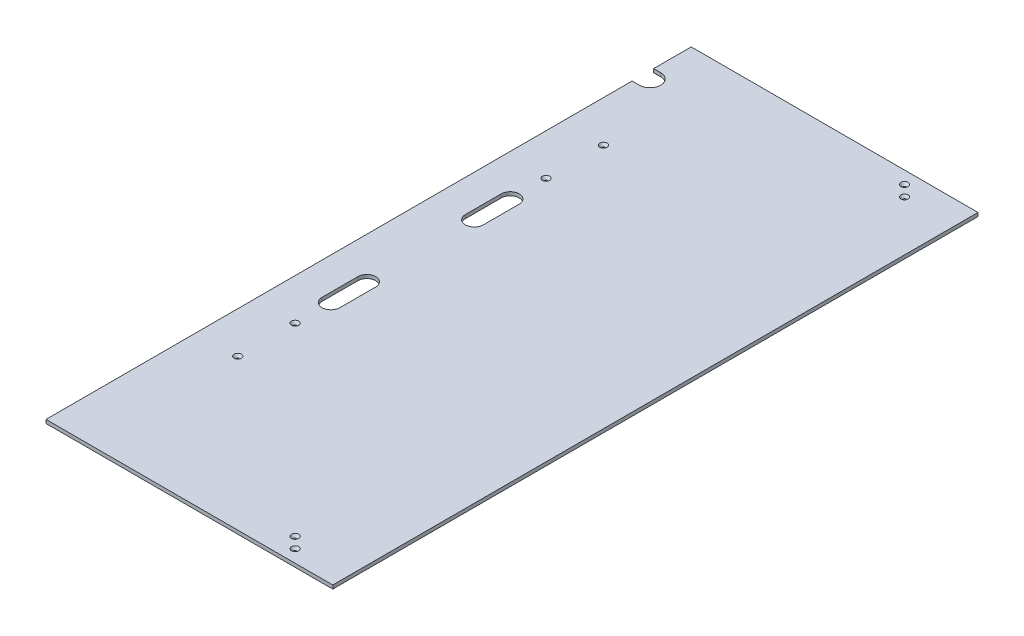
ISO-10303-21;
HEADER;
FILE_DESCRIPTION(('STEP AP214'),'2;1');
FILE_NAME('part.step','',(''),(''),'','','');
FILE_SCHEMA(('AUTOMOTIVE_DESIGN { 1 0 10303 214 1 1 1 1 }'));
ENDSEC;
DATA;
#1=APPLICATION_CONTEXT('core data for automotive mechanical design processes');
#2=APPLICATION_PROTOCOL_DEFINITION('international standard','automotive_design',2000,#1);
#3=PRODUCT_CONTEXT('',#1,'mechanical');
#4=PRODUCT('Part','Part','',(#3));
#5=PRODUCT_RELATED_PRODUCT_CATEGORY('part','',(#4));
#6=PRODUCT_DEFINITION_FORMATION('','',#4);
#7=PRODUCT_DEFINITION_CONTEXT('part definition',#1,'design');
#8=PRODUCT_DEFINITION('design','',#6,#7);
#9=PRODUCT_DEFINITION_SHAPE('','',#8);
#10=(LENGTH_UNIT() NAMED_UNIT(*) SI_UNIT(.MILLI.,.METRE.));
#11=(NAMED_UNIT(*) PLANE_ANGLE_UNIT() SI_UNIT($,.RADIAN.));
#12=(NAMED_UNIT(*) SI_UNIT($,.STERADIAN.) SOLID_ANGLE_UNIT());
#13=UNCERTAINTY_MEASURE_WITH_UNIT(LENGTH_MEASURE(1.E-05),#10,'distance_accuracy_value','');
#14=(GEOMETRIC_REPRESENTATION_CONTEXT(3) GLOBAL_UNCERTAINTY_ASSIGNED_CONTEXT((#13)) GLOBAL_UNIT_ASSIGNED_CONTEXT((#10,
#11,#12)) REPRESENTATION_CONTEXT('',''));
#15=CARTESIAN_POINT('',(0.,0.,0.));
#16=DIRECTION('',(0.,0.,1.));
#17=DIRECTION('',(1.,0.,0.));
#18=AXIS2_PLACEMENT_3D('',#15,#16,#17);
#19=CARTESIAN_POINT('',(-180.975,6.34999999994079,203.2));
#20=DIRECTION('',(0.,1.,0.));
#21=DIRECTION('',(0.,0.,1.));
#22=AXIS2_PLACEMENT_3D('',#19,#20,#21);
#23=CONICAL_SURFACE('',#22,6.43889999993152,0.715584993313781);
#24=CARTESIAN_POINT('',(-180.975,1.87943829585783,203.2));
#25=DIRECTION('',(0.,1.,0.));
#26=DIRECTION('',(0.,0.,1.));
#27=AXIS2_PLACEMENT_3D('',#24,#25,#26);
#28=CIRCLE('',#27,2.5527);
#29=CARTESIAN_POINT('',(-180.975,1.87943829585783,205.7527));
#30=VERTEX_POINT('',#29);
#31=EDGE_CURVE('E203',#30,#30,#28,.F.);
#32=ORIENTED_EDGE('',*,*,#31,.T.);
#33=EDGE_LOOP('',(#32));
#34=FACE_BOUND('',#33,.T.);
#35=CARTESIAN_POINT('',(-180.975,6.34999999999764,203.2));
#36=DIRECTION('',(0.,1.,0.));
#37=DIRECTION('',(0.,0.,1.));
#38=AXIS2_PLACEMENT_3D('',#35,#36,#37);
#39=CIRCLE('',#38,6.43889999998094);
#40=CARTESIAN_POINT('',(-180.975,6.34999999999764,209.638899999981));
#41=VERTEX_POINT('',#40);
#42=EDGE_CURVE('E19',#41,#41,#39,.F.);
#43=ORIENTED_EDGE('',*,*,#42,.F.);
#44=EDGE_LOOP('',(#43));
#45=FACE_BOUND('',#44,.T.);
#46=ADVANCED_FACE('F16',(#34,#45),#23,.F.);
#47=CARTESIAN_POINT('',(-180.975,6.34999999994079,-241.3));
#48=DIRECTION('',(0.,1.,0.));
#49=DIRECTION('',(0.,0.,1.));
#50=AXIS2_PLACEMENT_3D('',#47,#48,#49);
#51=CONICAL_SURFACE('',#50,6.43889999993152,0.715584993313781);
#52=CARTESIAN_POINT('',(-180.975,1.87943829585783,-241.3));
#53=DIRECTION('',(0.,1.,0.));
#54=DIRECTION('',(0.,0.,1.));
#55=AXIS2_PLACEMENT_3D('',#52,#53,#54);
#56=CIRCLE('',#55,2.5527);
#57=CARTESIAN_POINT('',(-180.975,1.87943829585783,-238.7473));
#58=VERTEX_POINT('',#57);
#59=EDGE_CURVE('E200',#58,#58,#56,.F.);
#60=ORIENTED_EDGE('',*,*,#59,.T.);
#61=EDGE_LOOP('',(#60));
#62=FACE_BOUND('',#61,.T.);
#63=CARTESIAN_POINT('',(-180.975,6.34999999999764,-241.3));
#64=DIRECTION('',(0.,1.,0.));
#65=DIRECTION('',(0.,0.,1.));
#66=AXIS2_PLACEMENT_3D('',#63,#64,#65);
#67=CIRCLE('',#66,6.43889999998094);
#68=CARTESIAN_POINT('',(-180.975,6.34999999999764,-234.861100000019));
#69=VERTEX_POINT('',#68);
#70=EDGE_CURVE('E296',#69,#69,#67,.F.);
#71=ORIENTED_EDGE('',*,*,#70,.F.);
#72=EDGE_LOOP('',(#71));
#73=FACE_BOUND('',#72,.T.);
#74=ADVANCED_FACE('F305',(#62,#73),#51,.F.);
#75=CARTESIAN_POINT('',(-180.975,6.34999999994079,-342.9));
#76=DIRECTION('',(0.,1.,0.));
#77=DIRECTION('',(0.,0.,1.));
#78=AXIS2_PLACEMENT_3D('',#75,#76,#77);
#79=CONICAL_SURFACE('',#78,6.43889999993152,0.715584993313781);
#80=CARTESIAN_POINT('',(-180.975,1.87943829585783,-342.9));
#81=DIRECTION('',(0.,1.,0.));
#82=DIRECTION('',(0.,0.,1.));
#83=AXIS2_PLACEMENT_3D('',#80,#81,#82);
#84=CIRCLE('',#83,2.5527);
#85=CARTESIAN_POINT('',(-180.975,1.87943829585783,-340.3473));
#86=VERTEX_POINT('',#85);
#87=EDGE_CURVE('E197',#86,#86,#84,.F.);
#88=ORIENTED_EDGE('',*,*,#87,.T.);
#89=EDGE_LOOP('',(#88));
#90=FACE_BOUND('',#89,.T.);
#91=CARTESIAN_POINT('',(-180.975,6.34999999999764,-342.9));
#92=DIRECTION('',(0.,1.,0.));
#93=DIRECTION('',(0.,0.,1.));
#94=AXIS2_PLACEMENT_3D('',#91,#92,#93);
#95=CIRCLE('',#94,6.43889999998094);
#96=CARTESIAN_POINT('',(-180.975,6.34999999999764,-336.461100000019));
#97=VERTEX_POINT('',#96);
#98=EDGE_CURVE('E294',#97,#97,#95,.F.);
#99=ORIENTED_EDGE('',*,*,#98,.F.);
#100=EDGE_LOOP('',(#99));
#101=FACE_BOUND('',#100,.T.);
#102=ADVANCED_FACE('F311',(#90,#101),#79,.F.);
#103=CARTESIAN_POINT('',(165.1,6.34999999994079,549.275));
#104=DIRECTION('',(0.,1.,0.));
#105=DIRECTION('',(0.,0.,1.));
#106=AXIS2_PLACEMENT_3D('',#103,#104,#105);
#107=CONICAL_SURFACE('',#106,6.43889999997319,0.715584993313781);
#108=CARTESIAN_POINT('',(165.1,1.87943829585783,549.275));
#109=DIRECTION('',(0.,1.,0.));
#110=DIRECTION('',(0.,0.,1.));
#111=AXIS2_PLACEMENT_3D('',#108,#109,#110);
#112=CIRCLE('',#111,2.5527);
#113=CARTESIAN_POINT('',(165.1,1.87943829585783,551.8277));
#114=VERTEX_POINT('',#113);
#115=EDGE_CURVE('E194',#114,#114,#112,.F.);
#116=ORIENTED_EDGE('',*,*,#115,.T.);
#117=EDGE_LOOP('',(#116));
#118=FACE_BOUND('',#117,.T.);
#119=CARTESIAN_POINT('',(165.1,6.34999999999764,549.275));
#120=DIRECTION('',(0.,1.,0.));
#121=DIRECTION('',(0.,0.,1.));
#122=AXIS2_PLACEMENT_3D('',#119,#120,#121);
#123=CIRCLE('',#122,6.4389000000226);
#124=CARTESIAN_POINT('',(165.1,6.34999999999764,555.713900000022));
#125=VERTEX_POINT('',#124);
#126=EDGE_CURVE('E291',#125,#125,#123,.F.);
#127=ORIENTED_EDGE('',*,*,#126,.F.);
#128=EDGE_LOOP('',(#127));
#129=FACE_BOUND('',#128,.T.);
#130=ADVANCED_FACE('F430',(#118,#129),#107,.F.);
#131=CARTESIAN_POINT('',(146.05,6.34999999994079,530.225));
#132=DIRECTION('',(0.,1.,0.));
#133=DIRECTION('',(0.,0.,1.));
#134=AXIS2_PLACEMENT_3D('',#131,#132,#133);
#135=CONICAL_SURFACE('',#134,6.43889999992345,0.715584993313781);
#136=CARTESIAN_POINT('',(146.05,1.87943829585783,530.225));
#137=DIRECTION('',(0.,1.,0.));
#138=DIRECTION('',(0.,0.,1.));
#139=AXIS2_PLACEMENT_3D('',#136,#137,#138);
#140=CIRCLE('',#139,2.5527);
#141=CARTESIAN_POINT('',(146.05,1.87943829585783,532.7777));
#142=VERTEX_POINT('',#141);
#143=EDGE_CURVE('E191',#142,#142,#140,.F.);
#144=ORIENTED_EDGE('',*,*,#143,.T.);
#145=EDGE_LOOP('',(#144));
#146=FACE_BOUND('',#145,.T.);
#147=CARTESIAN_POINT('',(146.05,6.34999999999764,530.225));
#148=DIRECTION('',(0.,1.,0.));
#149=DIRECTION('',(0.,0.,1.));
#150=AXIS2_PLACEMENT_3D('',#147,#148,#149);
#151=CIRCLE('',#150,6.43889999997286);
#152=CARTESIAN_POINT('',(146.05,6.34999999999764,536.663899999973));
#153=VERTEX_POINT('',#152);
#154=EDGE_CURVE('E288',#153,#153,#151,.F.);
#155=ORIENTED_EDGE('',*,*,#154,.F.);
#156=EDGE_LOOP('',(#155));
#157=FACE_BOUND('',#156,.T.);
#158=ADVANCED_FACE('F426',(#146,#157),#135,.F.);
#159=CARTESIAN_POINT('',(-180.975,6.34999999994079,304.8));
#160=DIRECTION('',(0.,1.,0.));
#161=DIRECTION('',(0.,0.,1.));
#162=AXIS2_PLACEMENT_3D('',#159,#160,#161);
#163=CONICAL_SURFACE('',#162,6.43889999993152,0.715584993313781);
#164=CARTESIAN_POINT('',(-180.975,1.87943829585783,304.8));
#165=DIRECTION('',(0.,1.,0.));
#166=DIRECTION('',(0.,0.,1.));
#167=AXIS2_PLACEMENT_3D('',#164,#165,#166);
#168=CIRCLE('',#167,2.5527);
#169=CARTESIAN_POINT('',(-180.975,1.87943829585783,307.3527));
#170=VERTEX_POINT('',#169);
#171=EDGE_CURVE('E188',#170,#170,#168,.F.);
#172=ORIENTED_EDGE('',*,*,#171,.T.);
#173=EDGE_LOOP('',(#172));
#174=FACE_BOUND('',#173,.T.);
#175=CARTESIAN_POINT('',(-180.975,6.34999999999764,304.8));
#176=DIRECTION('',(0.,1.,0.));
#177=DIRECTION('',(0.,0.,1.));
#178=AXIS2_PLACEMENT_3D('',#175,#176,#177);
#179=CIRCLE('',#178,6.43889999998094);
#180=CARTESIAN_POINT('',(-180.975,6.34999999999764,311.238899999981));
#181=VERTEX_POINT('',#180);
#182=EDGE_CURVE('E285',#181,#181,#179,.F.);
#183=ORIENTED_EDGE('',*,*,#182,.F.);
#184=EDGE_LOOP('',(#183));
#185=FACE_BOUND('',#184,.T.);
#186=ADVANCED_FACE('F422',(#174,#185),#163,.F.);
#187=CARTESIAN_POINT('',(146.05,6.34999999994079,-549.275));
#188=DIRECTION('',(0.,1.,0.));
#189=DIRECTION('',(0.,0.,1.));
#190=AXIS2_PLACEMENT_3D('',#187,#188,#189);
#191=CONICAL_SURFACE('',#190,6.43889999992345,0.715584993313781);
#192=CARTESIAN_POINT('',(146.05,1.87943829585783,-549.275));
#193=DIRECTION('',(0.,1.,0.));
#194=DIRECTION('',(0.,0.,1.));
#195=AXIS2_PLACEMENT_3D('',#192,#193,#194);
#196=CIRCLE('',#195,2.5527);
#197=CARTESIAN_POINT('',(146.05,1.87943829585783,-546.7223));
#198=VERTEX_POINT('',#197);
#199=EDGE_CURVE('E185',#198,#198,#196,.F.);
#200=ORIENTED_EDGE('',*,*,#199,.T.);
#201=EDGE_LOOP('',(#200));
#202=FACE_BOUND('',#201,.T.);
#203=CARTESIAN_POINT('',(146.05,6.34999999999764,-549.275));
#204=DIRECTION('',(0.,1.,0.));
#205=DIRECTION('',(0.,0.,1.));
#206=AXIS2_PLACEMENT_3D('',#203,#204,#205);
#207=CIRCLE('',#206,6.43889999997286);
#208=CARTESIAN_POINT('',(146.05,6.34999999999764,-542.836100000027));
#209=VERTEX_POINT('',#208);
#210=EDGE_CURVE('E282',#209,#209,#207,.F.);
#211=ORIENTED_EDGE('',*,*,#210,.F.);
#212=EDGE_LOOP('',(#211));
#213=FACE_BOUND('',#212,.T.);
#214=ADVANCED_FACE('F418',(#202,#213),#191,.F.);
#215=CARTESIAN_POINT('',(165.1,6.34999999994079,-530.225));
#216=DIRECTION('',(0.,1.,0.));
#217=DIRECTION('',(0.,0.,1.));
#218=AXIS2_PLACEMENT_3D('',#215,#216,#217);
#219=CONICAL_SURFACE('',#218,6.43889999997319,0.715584993313781);
#220=CARTESIAN_POINT('',(165.1,1.87943829585783,-530.225));
#221=DIRECTION('',(0.,1.,0.));
#222=DIRECTION('',(0.,0.,1.));
#223=AXIS2_PLACEMENT_3D('',#220,#221,#222);
#224=CIRCLE('',#223,2.5527);
#225=CARTESIAN_POINT('',(165.1,1.87943829585783,-527.6723));
#226=VERTEX_POINT('',#225);
#227=EDGE_CURVE('E182',#226,#226,#224,.F.);
#228=ORIENTED_EDGE('',*,*,#227,.T.);
#229=EDGE_LOOP('',(#228));
#230=FACE_BOUND('',#229,.T.);
#231=CARTESIAN_POINT('',(165.1,6.34999999999764,-530.225));
#232=DIRECTION('',(0.,1.,0.));
#233=DIRECTION('',(0.,0.,1.));
#234=AXIS2_PLACEMENT_3D('',#231,#232,#233);
#235=CIRCLE('',#234,6.4389000000226);
#236=CARTESIAN_POINT('',(165.1,6.34999999999764,-523.786099999977));
#237=VERTEX_POINT('',#236);
#238=EDGE_CURVE('E152',#237,#237,#235,.F.);
#239=ORIENTED_EDGE('',*,*,#238,.F.);
#240=EDGE_LOOP('',(#239));
#241=FACE_BOUND('',#240,.T.);
#242=ADVANCED_FACE('F414',(#230,#241),#219,.F.);
#243=CARTESIAN_POINT('',(254.,6.35,-571.5));
#244=DIRECTION('',(0.,1.,0.));
#245=DIRECTION('',(0.,0.,1.));
#246=AXIS2_PLACEMENT_3D('',#243,#244,#245);
#247=PLANE('',#246);
#248=DIRECTION('',(0.,0.,-1.));
#249=VECTOR('',#248,1.);
#250=CARTESIAN_POINT('',(-165.1,6.35,-114.3));
#251=LINE('',#250,#249);
#252=CARTESIAN_POINT('',(-165.1,6.35,-177.8));
#253=VERTEX_POINT('',#252);
#254=CARTESIAN_POINT('',(-165.1,6.35,-114.3));
#255=VERTEX_POINT('',#254);
#256=EDGE_CURVE('E171',#253,#255,#251,.F.);
#257=ORIENTED_EDGE('',*,*,#256,.T.);
#258=CARTESIAN_POINT('',(-180.975,6.35,-114.3));
#259=DIRECTION('',(0.,1.,0.));
#260=DIRECTION('',(0.,0.,1.));
#261=AXIS2_PLACEMENT_3D('',#258,#259,#260);
#262=CIRCLE('',#261,15.875);
#263=CARTESIAN_POINT('',(-196.85,6.35,-114.3));
#264=VERTEX_POINT('',#263);
#265=EDGE_CURVE('E271',#255,#264,#262,.F.);
#266=ORIENTED_EDGE('',*,*,#265,.T.);
#267=DIRECTION('',(0.,0.,1.));
#268=VECTOR('',#267,1.);
#269=CARTESIAN_POINT('',(-196.85,6.35,-177.8));
#270=LINE('',#269,#268);
#271=CARTESIAN_POINT('',(-196.85,6.35,-177.8));
#272=VERTEX_POINT('',#271);
#273=EDGE_CURVE('E167',#264,#272,#270,.F.);
#274=ORIENTED_EDGE('',*,*,#273,.T.);
#275=CARTESIAN_POINT('',(-180.975,6.35,-177.8));
#276=DIRECTION('',(0.,1.,0.));
#277=DIRECTION('',(0.,0.,1.));
#278=AXIS2_PLACEMENT_3D('',#275,#276,#277);
#279=CIRCLE('',#278,15.875);
#280=EDGE_CURVE('E173',#272,#253,#279,.F.);
#281=ORIENTED_EDGE('',*,*,#280,.T.);
#282=EDGE_LOOP('',(#257,#266,#274,#281));
#283=FACE_BOUND('',#282,.T.);
#284=DIRECTION('',(0.,0.,-1.));
#285=VECTOR('',#284,1.);
#286=CARTESIAN_POINT('',(-165.1,6.35,139.7));
#287=LINE('',#286,#285);
#288=CARTESIAN_POINT('',(-165.1,6.35,76.2));
#289=VERTEX_POINT('',#288);
#290=CARTESIAN_POINT('',(-165.1,6.35,139.7));
#291=VERTEX_POINT('',#290);
#292=EDGE_CURVE('E179',#289,#291,#287,.F.);
#293=ORIENTED_EDGE('',*,*,#292,.T.);
#294=CARTESIAN_POINT('',(-180.975,6.35,139.7));
#295=DIRECTION('',(0.,1.,0.));
#296=DIRECTION('',(0.,0.,1.));
#297=AXIS2_PLACEMENT_3D('',#294,#295,#296);
#298=CIRCLE('',#297,15.875);
#299=CARTESIAN_POINT('',(-196.85,6.35,139.7));
#300=VERTEX_POINT('',#299);
#301=EDGE_CURVE('E275',#291,#300,#298,.F.);
#302=ORIENTED_EDGE('',*,*,#301,.T.);
#303=DIRECTION('',(0.,0.,1.));
#304=VECTOR('',#303,1.);
#305=CARTESIAN_POINT('',(-196.85,6.35,76.2));
#306=LINE('',#305,#304);
#307=CARTESIAN_POINT('',(-196.85,6.35,76.2));
#308=VERTEX_POINT('',#307);
#309=EDGE_CURVE('E175',#300,#308,#306,.F.);
#310=ORIENTED_EDGE('',*,*,#309,.T.);
#311=CARTESIAN_POINT('',(-180.975,6.35,76.2));
#312=DIRECTION('',(0.,1.,0.));
#313=DIRECTION('',(0.,0.,1.));
#314=AXIS2_PLACEMENT_3D('',#311,#312,#313);
#315=CIRCLE('',#314,15.875);
#316=EDGE_CURVE('E181',#308,#289,#315,.F.);
#317=ORIENTED_EDGE('',*,*,#316,.T.);
#318=EDGE_LOOP('',(#293,#302,#310,#317));
#319=FACE_BOUND('',#318,.T.);
#320=ORIENTED_EDGE('',*,*,#238,.T.);
#321=EDGE_LOOP('',(#320));
#322=FACE_BOUND('',#321,.T.);
#323=ORIENTED_EDGE('',*,*,#210,.T.);
#324=EDGE_LOOP('',(#323));
#325=FACE_BOUND('',#324,.T.);
#326=ORIENTED_EDGE('',*,*,#182,.T.);
#327=EDGE_LOOP('',(#326));
#328=FACE_BOUND('',#327,.T.);
#329=ORIENTED_EDGE('',*,*,#154,.T.);
#330=EDGE_LOOP('',(#329));
#331=FACE_BOUND('',#330,.T.);
#332=ORIENTED_EDGE('',*,*,#126,.T.);
#333=EDGE_LOOP('',(#332));
#334=FACE_BOUND('',#333,.T.);
#335=ORIENTED_EDGE('',*,*,#98,.T.);
#336=EDGE_LOOP('',(#335));
#337=FACE_BOUND('',#336,.T.);
#338=ORIENTED_EDGE('',*,*,#70,.T.);
#339=EDGE_LOOP('',(#338));
#340=FACE_BOUND('',#339,.T.);
#341=ORIENTED_EDGE('',*,*,#42,.T.);
#342=EDGE_LOOP('',(#341));
#343=FACE_BOUND('',#342,.T.);
#344=DIRECTION('',(-1.,0.,0.));
#345=VECTOR('',#344,1.);
#346=CARTESIAN_POINT('',(-241.3,6.35,-504.825));
#347=LINE('',#346,#345);
#348=CARTESIAN_POINT('',(-254.,6.35,-504.825));
#349=VERTEX_POINT('',#348);
#350=CARTESIAN_POINT('',(-241.3,6.35,-504.825));
#351=VERTEX_POINT('',#350);
#352=EDGE_CURVE('E140',#349,#351,#347,.F.);
#353=ORIENTED_EDGE('',*,*,#352,.T.);
#354=CARTESIAN_POINT('',(-241.3,6.35,-485.775));
#355=DIRECTION('',(0.,1.,0.));
#356=DIRECTION('',(0.,0.,1.));
#357=AXIS2_PLACEMENT_3D('',#354,#355,#356);
#358=CIRCLE('',#357,19.05);
#359=CARTESIAN_POINT('',(-241.3,6.35,-466.725));
#360=VERTEX_POINT('',#359);
#361=EDGE_CURVE('E97',#351,#360,#358,.F.);
#362=ORIENTED_EDGE('',*,*,#361,.T.);
#363=DIRECTION('',(1.,0.,0.));
#364=VECTOR('',#363,1.);
#365=CARTESIAN_POINT('',(-254.,6.35,-466.725));
#366=LINE('',#365,#364);
#367=CARTESIAN_POINT('',(-254.,6.35,-466.725));
#368=VERTEX_POINT('',#367);
#369=EDGE_CURVE('E106',#360,#368,#366,.F.);
#370=ORIENTED_EDGE('',*,*,#369,.T.);
#371=DIRECTION('',(0.,0.,1.));
#372=VECTOR('',#371,1.);
#373=CARTESIAN_POINT('',(-254.,6.35,-571.5));
#374=LINE('',#373,#372);
#375=CARTESIAN_POINT('',(-254.,6.35,571.5));
#376=VERTEX_POINT('',#375);
#377=EDGE_CURVE('E209',#376,#368,#374,.F.);
#378=ORIENTED_EDGE('',*,*,#377,.F.);
#379=DIRECTION('',(1.,0.,0.));
#380=VECTOR('',#379,1.);
#381=CARTESIAN_POINT('',(0.,6.35,571.5));
#382=LINE('',#381,#380);
#383=CARTESIAN_POINT('',(254.,6.35,571.5));
#384=VERTEX_POINT('',#383);
#385=EDGE_CURVE('E218',#384,#376,#382,.F.);
#386=ORIENTED_EDGE('',*,*,#385,.F.);
#387=DIRECTION('',(0.,0.,-1.));
#388=VECTOR('',#387,1.);
#389=CARTESIAN_POINT('',(254.,6.35,-571.5));
#390=LINE('',#389,#388);
#391=CARTESIAN_POINT('',(254.,6.35,-571.5));
#392=VERTEX_POINT('',#391);
#393=EDGE_CURVE('E223',#392,#384,#390,.F.);
#394=ORIENTED_EDGE('',*,*,#393,.F.);
#395=DIRECTION('',(1.,0.,0.));
#396=VECTOR('',#395,1.);
#397=CARTESIAN_POINT('',(0.,6.35,-571.5));
#398=LINE('',#397,#396);
#399=CARTESIAN_POINT('',(-254.,6.35,-571.5));
#400=VERTEX_POINT('',#399);
#401=EDGE_CURVE('E135',#392,#400,#398,.F.);
#402=ORIENTED_EDGE('',*,*,#401,.T.);
#403=DIRECTION('',(0.,0.,1.));
#404=VECTOR('',#403,1.);
#405=CARTESIAN_POINT('',(-254.,6.35,-571.5));
#406=LINE('',#405,#404);
#407=EDGE_CURVE('E137',#349,#400,#406,.F.);
#408=ORIENTED_EDGE('',*,*,#407,.F.);
#409=EDGE_LOOP('',(#353,#362,#370,#378,#386,#394,#402,#408));
#410=FACE_BOUND('',#409,.T.);
#411=ADVANCED_FACE('F139',(#283,#319,#322,#325,#328,#331,#334,#337,#340,#343,#410),#247,.T.);
#412=CARTESIAN_POINT('',(-241.3,6.35,-504.825));
#413=DIRECTION('',(0.,0.,-1.));
#414=DIRECTION('',(-1.,0.,0.));
#415=AXIS2_PLACEMENT_3D('',#412,#413,#414);
#416=PLANE('',#415);
#417=ORIENTED_EDGE('',*,*,#352,.F.);
#418=DIRECTION('',(0.,1.,0.));
#419=VECTOR('',#418,1.);
#420=CARTESIAN_POINT('',(-254.,6.35,-504.825));
#421=LINE('',#420,#419);
#422=CARTESIAN_POINT('',(-254.,0.,-504.825));
#423=VERTEX_POINT('',#422);
#424=EDGE_CURVE('E145',#423,#349,#421,.T.);
#425=ORIENTED_EDGE('',*,*,#424,.F.);
#426=DIRECTION('',(1.,0.,0.));
#427=VECTOR('',#426,1.);
#428=CARTESIAN_POINT('',(-254.,0.,-504.825));
#429=LINE('',#428,#427);
#430=CARTESIAN_POINT('',(-241.3,0.,-504.825));
#431=VERTEX_POINT('',#430);
#432=EDGE_CURVE('E665',#431,#423,#429,.F.);
#433=ORIENTED_EDGE('',*,*,#432,.F.);
#434=DIRECTION('',(0.,1.,0.));
#435=VECTOR('',#434,1.);
#436=CARTESIAN_POINT('',(-241.3,6.35,-504.825));
#437=LINE('',#436,#435);
#438=EDGE_CURVE('E151',#431,#351,#437,.T.);
#439=ORIENTED_EDGE('',*,*,#438,.T.);
#440=EDGE_LOOP('',(#417,#425,#433,#439));
#441=FACE_BOUND('',#440,.T.);
#442=ADVANCED_FACE('F148',(#441),#416,.F.);
#443=CARTESIAN_POINT('',(-254.,6.35,-571.5));
#444=DIRECTION('',(-1.,0.,0.));
#445=DIRECTION('',(0.,0.,1.));
#446=AXIS2_PLACEMENT_3D('',#443,#444,#445);
#447=PLANE('',#446);
#448=DIRECTION('',(0.,0.,-1.));
#449=VECTOR('',#448,1.);
#450=CARTESIAN_POINT('',(-254.,0.,-571.5));
#451=LINE('',#450,#449);
#452=CARTESIAN_POINT('',(-254.,0.,-571.5));
#453=VERTEX_POINT('',#452);
#454=EDGE_CURVE('E156',#423,#453,#451,.T.);
#455=ORIENTED_EDGE('',*,*,#454,.F.);
#456=ORIENTED_EDGE('',*,*,#424,.T.);
#457=ORIENTED_EDGE('',*,*,#407,.T.);
#458=DIRECTION('',(0.,1.,0.));
#459=VECTOR('',#458,1.);
#460=CARTESIAN_POINT('',(-254.,0.,-571.5));
#461=LINE('',#460,#459);
#462=EDGE_CURVE('E159',#400,#453,#461,.F.);
#463=ORIENTED_EDGE('',*,*,#462,.T.);
#464=EDGE_LOOP('',(#455,#456,#457,#463));
#465=FACE_BOUND('',#464,.T.);
#466=ADVANCED_FACE('F154',(#465),#447,.T.);
#467=CARTESIAN_POINT('',(0.,0.,-571.5));
#468=DIRECTION('',(0.,0.,1.));
#469=DIRECTION('',(1.,0.,0.));
#470=AXIS2_PLACEMENT_3D('',#467,#468,#469);
#471=PLANE('',#470);
#472=ORIENTED_EDGE('',*,*,#401,.F.);
#473=DIRECTION('',(0.,1.,0.));
#474=VECTOR('',#473,1.);
#475=CARTESIAN_POINT('',(254.,0.,-571.5));
#476=LINE('',#475,#474);
#477=CARTESIAN_POINT('',(254.,0.,-571.5));
#478=VERTEX_POINT('',#477);
#479=EDGE_CURVE('E225',#478,#392,#476,.T.);
#480=ORIENTED_EDGE('',*,*,#479,.F.);
#481=DIRECTION('',(1.,0.,0.));
#482=VECTOR('',#481,1.);
#483=CARTESIAN_POINT('',(-254.,0.,-571.5));
#484=LINE('',#483,#482);
#485=EDGE_CURVE('E698',#453,#478,#484,.T.);
#486=ORIENTED_EDGE('',*,*,#485,.F.);
#487=ORIENTED_EDGE('',*,*,#462,.F.);
#488=EDGE_LOOP('',(#472,#480,#486,#487));
#489=FACE_BOUND('',#488,.T.);
#490=ADVANCED_FACE('F403',(#489),#471,.F.);
#491=CARTESIAN_POINT('',(254.,0.,-571.5));
#492=DIRECTION('',(1.,0.,0.));
#493=DIRECTION('',(0.,0.,-1.));
#494=AXIS2_PLACEMENT_3D('',#491,#492,#493);
#495=PLANE('',#494);
#496=DIRECTION('',(0.,0.,-1.));
#497=VECTOR('',#496,1.);
#498=CARTESIAN_POINT('',(254.,0.,-571.5));
#499=LINE('',#498,#497);
#500=CARTESIAN_POINT('',(254.,0.,571.5));
#501=VERTEX_POINT('',#500);
#502=EDGE_CURVE('E689',#478,#501,#499,.F.);
#503=ORIENTED_EDGE('',*,*,#502,.F.);
#504=ORIENTED_EDGE('',*,*,#479,.T.);
#505=ORIENTED_EDGE('',*,*,#393,.T.);
#506=DIRECTION('',(0.,1.,0.));
#507=VECTOR('',#506,1.);
#508=CARTESIAN_POINT('',(254.,0.,571.5));
#509=LINE('',#508,#507);
#510=EDGE_CURVE('E220',#501,#384,#509,.T.);
#511=ORIENTED_EDGE('',*,*,#510,.F.);
#512=EDGE_LOOP('',(#503,#504,#505,#511));
#513=FACE_BOUND('',#512,.T.);
#514=ADVANCED_FACE('F399',(#513),#495,.T.);
#515=CARTESIAN_POINT('',(0.,0.,571.5));
#516=DIRECTION('',(0.,0.,1.));
#517=DIRECTION('',(1.,0.,0.));
#518=AXIS2_PLACEMENT_3D('',#515,#516,#517);
#519=PLANE('',#518);
#520=DIRECTION('',(0.,1.,0.));
#521=VECTOR('',#520,1.);
#522=CARTESIAN_POINT('',(-254.,6.35,571.5));
#523=LINE('',#522,#521);
#524=CARTESIAN_POINT('',(-254.,0.,571.5));
#525=VERTEX_POINT('',#524);
#526=EDGE_CURVE('E215',#525,#376,#523,.T.);
#527=ORIENTED_EDGE('',*,*,#526,.F.);
#528=DIRECTION('',(1.,0.,0.));
#529=VECTOR('',#528,1.);
#530=CARTESIAN_POINT('',(-254.,0.,571.5));
#531=LINE('',#530,#529);
#532=EDGE_CURVE('E680',#501,#525,#531,.F.);
#533=ORIENTED_EDGE('',*,*,#532,.F.);
#534=ORIENTED_EDGE('',*,*,#510,.T.);
#535=ORIENTED_EDGE('',*,*,#385,.T.);
#536=EDGE_LOOP('',(#527,#533,#534,#535));
#537=FACE_BOUND('',#536,.T.);
#538=ADVANCED_FACE('F395',(#537),#519,.T.);
#539=CARTESIAN_POINT('',(-254.,6.35,-571.5));
#540=DIRECTION('',(-1.,0.,0.));
#541=DIRECTION('',(0.,0.,1.));
#542=AXIS2_PLACEMENT_3D('',#539,#540,#541);
#543=PLANE('',#542);
#544=ORIENTED_EDGE('',*,*,#377,.T.);
#545=DIRECTION('',(0.,1.,0.));
#546=VECTOR('',#545,1.);
#547=CARTESIAN_POINT('',(-254.,6.35,-466.725));
#548=LINE('',#547,#546);
#549=CARTESIAN_POINT('',(-254.,0.,-466.725));
#550=VERTEX_POINT('',#549);
#551=EDGE_CURVE('E208',#368,#550,#548,.F.);
#552=ORIENTED_EDGE('',*,*,#551,.T.);
#553=DIRECTION('',(0.,0.,-1.));
#554=VECTOR('',#553,1.);
#555=CARTESIAN_POINT('',(-254.,0.,-571.5));
#556=LINE('',#555,#554);
#557=EDGE_CURVE('E678',#525,#550,#556,.T.);
#558=ORIENTED_EDGE('',*,*,#557,.F.);
#559=ORIENTED_EDGE('',*,*,#526,.T.);
#560=EDGE_LOOP('',(#544,#552,#558,#559));
#561=FACE_BOUND('',#560,.T.);
#562=ADVANCED_FACE('F391',(#561),#543,.T.);
#563=CARTESIAN_POINT('',(-254.,6.35,-466.725));
#564=DIRECTION('',(0.,0.,1.));
#565=DIRECTION('',(1.,0.,0.));
#566=AXIS2_PLACEMENT_3D('',#563,#564,#565);
#567=PLANE('',#566);
#568=ORIENTED_EDGE('',*,*,#369,.F.);
#569=DIRECTION('',(0.,1.,0.));
#570=VECTOR('',#569,1.);
#571=CARTESIAN_POINT('',(-241.3,6.35,-466.725));
#572=LINE('',#571,#570);
#573=CARTESIAN_POINT('',(-241.3,0.,-466.725));
#574=VERTEX_POINT('',#573);
#575=EDGE_CURVE('E206',#360,#574,#572,.F.);
#576=ORIENTED_EDGE('',*,*,#575,.T.);
#577=DIRECTION('',(1.,0.,0.));
#578=VECTOR('',#577,1.);
#579=CARTESIAN_POINT('',(-254.,0.,-466.725));
#580=LINE('',#579,#578);
#581=EDGE_CURVE('E270',#550,#574,#580,.T.);
#582=ORIENTED_EDGE('',*,*,#581,.F.);
#583=ORIENTED_EDGE('',*,*,#551,.F.);
#584=EDGE_LOOP('',(#568,#576,#582,#583));
#585=FACE_BOUND('',#584,.T.);
#586=ADVANCED_FACE('F388',(#585),#567,.F.);
#587=CARTESIAN_POINT('',(-241.3,6.35,-485.775));
#588=DIRECTION('',(0.,1.,0.));
#589=DIRECTION('',(0.,0.,1.));
#590=AXIS2_PLACEMENT_3D('',#587,#588,#589);
#591=CYLINDRICAL_SURFACE('',#590,19.05);
#592=ORIENTED_EDGE('',*,*,#361,.F.);
#593=ORIENTED_EDGE('',*,*,#438,.F.);
#594=CARTESIAN_POINT('',(-241.3,0.,-485.775));
#595=DIRECTION('',(0.,1.,0.));
#596=DIRECTION('',(0.,0.,1.));
#597=AXIS2_PLACEMENT_3D('',#594,#595,#596);
#598=CIRCLE('',#597,19.05);
#599=EDGE_CURVE('E268',#574,#431,#598,.T.);
#600=ORIENTED_EDGE('',*,*,#599,.F.);
#601=ORIENTED_EDGE('',*,*,#575,.F.);
#602=EDGE_LOOP('',(#592,#593,#600,#601));
#603=FACE_BOUND('',#602,.T.);
#604=ADVANCED_FACE('F384',(#603),#591,.F.);
#605=CARTESIAN_POINT('',(-180.975,-1.63080957782746,203.2));
#606=DIRECTION('',(0.,1.,0.));
#607=DIRECTION('',(0.,0.,1.));
#608=AXIS2_PLACEMENT_3D('',#605,#606,#607);
#609=CYLINDRICAL_SURFACE('',#608,2.5527);
#610=ORIENTED_EDGE('',*,*,#31,.F.);
#611=EDGE_LOOP('',(#610));
#612=FACE_BOUND('',#611,.T.);
#613=CARTESIAN_POINT('',(-180.975,0.,203.2));
#614=DIRECTION('',(0.,1.,0.));
#615=DIRECTION('',(0.,0.,1.));
#616=AXIS2_PLACEMENT_3D('',#613,#614,#615);
#617=CIRCLE('',#616,2.5527);
#618=CARTESIAN_POINT('',(-180.975,0.,205.7527));
#619=VERTEX_POINT('',#618);
#620=EDGE_CURVE('E265',#619,#619,#617,.T.);
#621=ORIENTED_EDGE('',*,*,#620,.F.);
#622=EDGE_LOOP('',(#621));
#623=FACE_BOUND('',#622,.T.);
#624=ADVANCED_FACE('F380',(#612,#623),#609,.F.);
#625=CARTESIAN_POINT('',(-180.975,-1.63080957782746,-241.3));
#626=DIRECTION('',(0.,1.,0.));
#627=DIRECTION('',(0.,0.,1.));
#628=AXIS2_PLACEMENT_3D('',#625,#626,#627);
#629=CYLINDRICAL_SURFACE('',#628,2.5527);
#630=CARTESIAN_POINT('',(-180.975,0.,-241.3));
#631=DIRECTION('',(0.,1.,0.));
#632=DIRECTION('',(0.,0.,1.));
#633=AXIS2_PLACEMENT_3D('',#630,#631,#632);
#634=CIRCLE('',#633,2.5527);
#635=CARTESIAN_POINT('',(-180.975,0.,-238.7473));
#636=VERTEX_POINT('',#635);
#637=EDGE_CURVE('E262',#636,#636,#634,.T.);
#638=ORIENTED_EDGE('',*,*,#637,.F.);
#639=EDGE_LOOP('',(#638));
#640=FACE_BOUND('',#639,.T.);
#641=ORIENTED_EDGE('',*,*,#59,.F.);
#642=EDGE_LOOP('',(#641));
#643=FACE_BOUND('',#642,.T.);
#644=ADVANCED_FACE('F376',(#640,#643),#629,.F.);
#645=CARTESIAN_POINT('',(-180.975,-1.63080957782746,-342.9));
#646=DIRECTION('',(0.,1.,0.));
#647=DIRECTION('',(0.,0.,1.));
#648=AXIS2_PLACEMENT_3D('',#645,#646,#647);
#649=CYLINDRICAL_SURFACE('',#648,2.5527);
#650=CARTESIAN_POINT('',(-180.975,0.,-342.9));
#651=DIRECTION('',(0.,1.,0.));
#652=DIRECTION('',(0.,0.,1.));
#653=AXIS2_PLACEMENT_3D('',#650,#651,#652);
#654=CIRCLE('',#653,2.5527);
#655=CARTESIAN_POINT('',(-180.975,0.,-340.3473));
#656=VERTEX_POINT('',#655);
#657=EDGE_CURVE('E259',#656,#656,#654,.T.);
#658=ORIENTED_EDGE('',*,*,#657,.F.);
#659=EDGE_LOOP('',(#658));
#660=FACE_BOUND('',#659,.T.);
#661=ORIENTED_EDGE('',*,*,#87,.F.);
#662=EDGE_LOOP('',(#661));
#663=FACE_BOUND('',#662,.T.);
#664=ADVANCED_FACE('F372',(#660,#663),#649,.F.);
#665=CARTESIAN_POINT('',(165.1,-1.63080957782746,549.275));
#666=DIRECTION('',(0.,1.,0.));
#667=DIRECTION('',(0.,0.,1.));
#668=AXIS2_PLACEMENT_3D('',#665,#666,#667);
#669=CYLINDRICAL_SURFACE('',#668,2.5527);
#670=ORIENTED_EDGE('',*,*,#115,.F.);
#671=EDGE_LOOP('',(#670));
#672=FACE_BOUND('',#671,.T.);
#673=CARTESIAN_POINT('',(165.1,0.,549.275));
#674=DIRECTION('',(0.,1.,0.));
#675=DIRECTION('',(0.,0.,1.));
#676=AXIS2_PLACEMENT_3D('',#673,#674,#675);
#677=CIRCLE('',#676,2.5527);
#678=CARTESIAN_POINT('',(165.1,0.,551.8277));
#679=VERTEX_POINT('',#678);
#680=EDGE_CURVE('E256',#679,#679,#677,.T.);
#681=ORIENTED_EDGE('',*,*,#680,.F.);
#682=EDGE_LOOP('',(#681));
#683=FACE_BOUND('',#682,.T.);
#684=ADVANCED_FACE('F368',(#672,#683),#669,.F.);
#685=CARTESIAN_POINT('',(146.05,-1.63080957782746,530.225));
#686=DIRECTION('',(0.,1.,0.));
#687=DIRECTION('',(0.,0.,1.));
#688=AXIS2_PLACEMENT_3D('',#685,#686,#687);
#689=CYLINDRICAL_SURFACE('',#688,2.5527);
#690=ORIENTED_EDGE('',*,*,#143,.F.);
#691=EDGE_LOOP('',(#690));
#692=FACE_BOUND('',#691,.T.);
#693=CARTESIAN_POINT('',(146.05,0.,530.225));
#694=DIRECTION('',(0.,1.,0.));
#695=DIRECTION('',(0.,0.,1.));
#696=AXIS2_PLACEMENT_3D('',#693,#694,#695);
#697=CIRCLE('',#696,2.5527);
#698=CARTESIAN_POINT('',(146.05,0.,532.7777));
#699=VERTEX_POINT('',#698);
#700=EDGE_CURVE('E253',#699,#699,#697,.T.);
#701=ORIENTED_EDGE('',*,*,#700,.F.);
#702=EDGE_LOOP('',(#701));
#703=FACE_BOUND('',#702,.T.);
#704=ADVANCED_FACE('F364',(#692,#703),#689,.F.);
#705=CARTESIAN_POINT('',(-180.975,-1.63080957782746,304.8));
#706=DIRECTION('',(0.,1.,0.));
#707=DIRECTION('',(0.,0.,1.));
#708=AXIS2_PLACEMENT_3D('',#705,#706,#707);
#709=CYLINDRICAL_SURFACE('',#708,2.5527);
#710=ORIENTED_EDGE('',*,*,#171,.F.);
#711=EDGE_LOOP('',(#710));
#712=FACE_BOUND('',#711,.T.);
#713=CARTESIAN_POINT('',(-180.975,0.,304.8));
#714=DIRECTION('',(0.,1.,0.));
#715=DIRECTION('',(0.,0.,1.));
#716=AXIS2_PLACEMENT_3D('',#713,#714,#715);
#717=CIRCLE('',#716,2.5527);
#718=CARTESIAN_POINT('',(-180.975,0.,307.3527));
#719=VERTEX_POINT('',#718);
#720=EDGE_CURVE('E250',#719,#719,#717,.T.);
#721=ORIENTED_EDGE('',*,*,#720,.F.);
#722=EDGE_LOOP('',(#721));
#723=FACE_BOUND('',#722,.T.);
#724=ADVANCED_FACE('F360',(#712,#723),#709,.F.);
#725=CARTESIAN_POINT('',(146.05,-1.63080957782746,-549.275));
#726=DIRECTION('',(0.,1.,0.));
#727=DIRECTION('',(0.,0.,1.));
#728=AXIS2_PLACEMENT_3D('',#725,#726,#727);
#729=CYLINDRICAL_SURFACE('',#728,2.5527);
#730=ORIENTED_EDGE('',*,*,#199,.F.);
#731=EDGE_LOOP('',(#730));
#732=FACE_BOUND('',#731,.T.);
#733=CARTESIAN_POINT('',(146.05,0.,-549.275));
#734=DIRECTION('',(0.,1.,0.));
#735=DIRECTION('',(0.,0.,1.));
#736=AXIS2_PLACEMENT_3D('',#733,#734,#735);
#737=CIRCLE('',#736,2.5527);
#738=CARTESIAN_POINT('',(146.05,0.,-546.7223));
#739=VERTEX_POINT('',#738);
#740=EDGE_CURVE('E247',#739,#739,#737,.T.);
#741=ORIENTED_EDGE('',*,*,#740,.F.);
#742=EDGE_LOOP('',(#741));
#743=FACE_BOUND('',#742,.T.);
#744=ADVANCED_FACE('F356',(#732,#743),#729,.F.);
#745=CARTESIAN_POINT('',(165.1,-1.63080957782746,-530.225));
#746=DIRECTION('',(0.,1.,0.));
#747=DIRECTION('',(0.,0.,1.));
#748=AXIS2_PLACEMENT_3D('',#745,#746,#747);
#749=CYLINDRICAL_SURFACE('',#748,2.5527);
#750=ORIENTED_EDGE('',*,*,#227,.F.);
#751=EDGE_LOOP('',(#750));
#752=FACE_BOUND('',#751,.T.);
#753=CARTESIAN_POINT('',(165.1,0.,-530.225));
#754=DIRECTION('',(0.,1.,0.));
#755=DIRECTION('',(0.,0.,1.));
#756=AXIS2_PLACEMENT_3D('',#753,#754,#755);
#757=CIRCLE('',#756,2.5527);
#758=CARTESIAN_POINT('',(165.1,0.,-527.6723));
#759=VERTEX_POINT('',#758);
#760=EDGE_CURVE('E244',#759,#759,#757,.T.);
#761=ORIENTED_EDGE('',*,*,#760,.F.);
#762=EDGE_LOOP('',(#761));
#763=FACE_BOUND('',#762,.T.);
#764=ADVANCED_FACE('F352',(#752,#763),#749,.F.);
#765=CARTESIAN_POINT('',(-165.1,6.35,139.7));
#766=DIRECTION('',(1.,0.,0.));
#767=DIRECTION('',(0.,0.,-1.));
#768=AXIS2_PLACEMENT_3D('',#765,#766,#767);
#769=PLANE('',#768);
#770=ORIENTED_EDGE('',*,*,#292,.F.);
#771=DIRECTION('',(0.,1.,0.));
#772=VECTOR('',#771,1.);
#773=CARTESIAN_POINT('',(-165.1,6.35,76.2));
#774=LINE('',#773,#772);
#775=CARTESIAN_POINT('',(-165.1,0.,76.2));
#776=VERTEX_POINT('',#775);
#777=EDGE_CURVE('E178',#289,#776,#774,.F.);
#778=ORIENTED_EDGE('',*,*,#777,.T.);
#779=DIRECTION('',(0.,0.,-1.));
#780=VECTOR('',#779,1.);
#781=CARTESIAN_POINT('',(-165.1,0.,-571.5));
#782=LINE('',#781,#780);
#783=CARTESIAN_POINT('',(-165.1,0.,139.7));
#784=VERTEX_POINT('',#783);
#785=EDGE_CURVE('E243',#784,#776,#782,.T.);
#786=ORIENTED_EDGE('',*,*,#785,.F.);
#787=DIRECTION('',(0.,1.,0.));
#788=VECTOR('',#787,1.);
#789=CARTESIAN_POINT('',(-165.1,6.35,139.7));
#790=LINE('',#789,#788);
#791=EDGE_CURVE('E277',#784,#291,#790,.T.);
#792=ORIENTED_EDGE('',*,*,#791,.T.);
#793=EDGE_LOOP('',(#770,#778,#786,#792));
#794=FACE_BOUND('',#793,.T.);
#795=ADVANCED_FACE('F348',(#794),#769,.F.);
#796=CARTESIAN_POINT('',(-180.975,6.35,76.2));
#797=DIRECTION('',(0.,1.,0.));
#798=DIRECTION('',(0.,0.,1.));
#799=AXIS2_PLACEMENT_3D('',#796,#797,#798);
#800=CYLINDRICAL_SURFACE('',#799,15.875);
#801=ORIENTED_EDGE('',*,*,#316,.F.);
#802=DIRECTION('',(0.,1.,0.));
#803=VECTOR('',#802,1.);
#804=CARTESIAN_POINT('',(-196.85,6.35,76.2));
#805=LINE('',#804,#803);
#806=CARTESIAN_POINT('',(-196.85,0.,76.2));
#807=VERTEX_POINT('',#806);
#808=EDGE_CURVE('E177',#308,#807,#805,.F.);
#809=ORIENTED_EDGE('',*,*,#808,.T.);
#810=CARTESIAN_POINT('',(-180.975,0.,76.2));
#811=DIRECTION('',(0.,1.,0.));
#812=DIRECTION('',(0.,0.,1.));
#813=AXIS2_PLACEMENT_3D('',#810,#811,#812);
#814=CIRCLE('',#813,15.875);
#815=EDGE_CURVE('E240',#776,#807,#814,.T.);
#816=ORIENTED_EDGE('',*,*,#815,.F.);
#817=ORIENTED_EDGE('',*,*,#777,.F.);
#818=EDGE_LOOP('',(#801,#809,#816,#817));
#819=FACE_BOUND('',#818,.T.);
#820=ADVANCED_FACE('F344',(#819),#800,.F.);
#821=CARTESIAN_POINT('',(-196.85,6.35,76.2));
#822=DIRECTION('',(-1.,0.,0.));
#823=DIRECTION('',(0.,0.,1.));
#824=AXIS2_PLACEMENT_3D('',#821,#822,#823);
#825=PLANE('',#824);
#826=ORIENTED_EDGE('',*,*,#309,.F.);
#827=DIRECTION('',(0.,1.,0.));
#828=VECTOR('',#827,1.);
#829=CARTESIAN_POINT('',(-196.85,6.35,139.7));
#830=LINE('',#829,#828);
#831=CARTESIAN_POINT('',(-196.85,0.,139.7));
#832=VERTEX_POINT('',#831);
#833=EDGE_CURVE('E174',#300,#832,#830,.F.);
#834=ORIENTED_EDGE('',*,*,#833,.T.);
#835=DIRECTION('',(0.,0.,-1.));
#836=VECTOR('',#835,1.);
#837=CARTESIAN_POINT('',(-196.85,0.,-571.5));
#838=LINE('',#837,#836);
#839=EDGE_CURVE('E239',#807,#832,#838,.F.);
#840=ORIENTED_EDGE('',*,*,#839,.F.);
#841=ORIENTED_EDGE('',*,*,#808,.F.);
#842=EDGE_LOOP('',(#826,#834,#840,#841));
#843=FACE_BOUND('',#842,.T.);
#844=ADVANCED_FACE('F340',(#843),#825,.F.);
#845=CARTESIAN_POINT('',(-180.975,6.35,139.7));
#846=DIRECTION('',(0.,1.,0.));
#847=DIRECTION('',(0.,0.,1.));
#848=AXIS2_PLACEMENT_3D('',#845,#846,#847);
#849=CYLINDRICAL_SURFACE('',#848,15.875);
#850=ORIENTED_EDGE('',*,*,#301,.F.);
#851=ORIENTED_EDGE('',*,*,#791,.F.);
#852=CARTESIAN_POINT('',(-180.975,0.,139.7));
#853=DIRECTION('',(0.,1.,0.));
#854=DIRECTION('',(0.,0.,1.));
#855=AXIS2_PLACEMENT_3D('',#852,#853,#854);
#856=CIRCLE('',#855,15.875);
#857=EDGE_CURVE('E236',#832,#784,#856,.T.);
#858=ORIENTED_EDGE('',*,*,#857,.F.);
#859=ORIENTED_EDGE('',*,*,#833,.F.);
#860=EDGE_LOOP('',(#850,#851,#858,#859));
#861=FACE_BOUND('',#860,.T.);
#862=ADVANCED_FACE('F336',(#861),#849,.F.);
#863=CARTESIAN_POINT('',(-165.1,6.35,-114.3));
#864=DIRECTION('',(1.,0.,0.));
#865=DIRECTION('',(0.,0.,-1.));
#866=AXIS2_PLACEMENT_3D('',#863,#864,#865);
#867=PLANE('',#866);
#868=ORIENTED_EDGE('',*,*,#256,.F.);
#869=DIRECTION('',(0.,1.,0.));
#870=VECTOR('',#869,1.);
#871=CARTESIAN_POINT('',(-165.1,6.35,-177.8));
#872=LINE('',#871,#870);
#873=CARTESIAN_POINT('',(-165.1,0.,-177.8));
#874=VERTEX_POINT('',#873);
#875=EDGE_CURVE('E170',#253,#874,#872,.F.);
#876=ORIENTED_EDGE('',*,*,#875,.T.);
#877=DIRECTION('',(0.,0.,-1.));
#878=VECTOR('',#877,1.);
#879=CARTESIAN_POINT('',(-165.1,0.,-571.5));
#880=LINE('',#879,#878);
#881=CARTESIAN_POINT('',(-165.1,0.,-114.3));
#882=VERTEX_POINT('',#881);
#883=EDGE_CURVE('E235',#882,#874,#880,.T.);
#884=ORIENTED_EDGE('',*,*,#883,.F.);
#885=DIRECTION('',(0.,1.,0.));
#886=VECTOR('',#885,1.);
#887=CARTESIAN_POINT('',(-165.1,6.35,-114.3));
#888=LINE('',#887,#886);
#889=EDGE_CURVE('E273',#882,#255,#888,.T.);
#890=ORIENTED_EDGE('',*,*,#889,.T.);
#891=EDGE_LOOP('',(#868,#876,#884,#890));
#892=FACE_BOUND('',#891,.T.);
#893=ADVANCED_FACE('F332',(#892),#867,.F.);
#894=CARTESIAN_POINT('',(-180.975,6.35,-177.8));
#895=DIRECTION('',(0.,1.,0.));
#896=DIRECTION('',(0.,0.,1.));
#897=AXIS2_PLACEMENT_3D('',#894,#895,#896);
#898=CYLINDRICAL_SURFACE('',#897,15.875);
#899=ORIENTED_EDGE('',*,*,#280,.F.);
#900=DIRECTION('',(0.,1.,0.));
#901=VECTOR('',#900,1.);
#902=CARTESIAN_POINT('',(-196.85,6.35,-177.8));
#903=LINE('',#902,#901);
#904=CARTESIAN_POINT('',(-196.85,0.,-177.8));
#905=VERTEX_POINT('',#904);
#906=EDGE_CURVE('E169',#272,#905,#903,.F.);
#907=ORIENTED_EDGE('',*,*,#906,.T.);
#908=CARTESIAN_POINT('',(-180.975,0.,-177.8));
#909=DIRECTION('',(0.,1.,0.));
#910=DIRECTION('',(0.,0.,1.));
#911=AXIS2_PLACEMENT_3D('',#908,#909,#910);
#912=CIRCLE('',#911,15.875);
#913=EDGE_CURVE('E232',#874,#905,#912,.T.);
#914=ORIENTED_EDGE('',*,*,#913,.F.);
#915=ORIENTED_EDGE('',*,*,#875,.F.);
#916=EDGE_LOOP('',(#899,#907,#914,#915));
#917=FACE_BOUND('',#916,.T.);
#918=ADVANCED_FACE('F329',(#917),#898,.F.);
#919=CARTESIAN_POINT('',(-196.85,6.35,-177.8));
#920=DIRECTION('',(-1.,0.,0.));
#921=DIRECTION('',(0.,0.,1.));
#922=AXIS2_PLACEMENT_3D('',#919,#920,#921);
#923=PLANE('',#922);
#924=ORIENTED_EDGE('',*,*,#273,.F.);
#925=DIRECTION('',(0.,1.,0.));
#926=VECTOR('',#925,1.);
#927=CARTESIAN_POINT('',(-196.85,6.35,-114.3));
#928=LINE('',#927,#926);
#929=CARTESIAN_POINT('',(-196.85,0.,-114.3));
#930=VERTEX_POINT('',#929);
#931=EDGE_CURVE('E34',#264,#930,#928,.F.);
#932=ORIENTED_EDGE('',*,*,#931,.T.);
#933=DIRECTION('',(0.,0.,-1.));
#934=VECTOR('',#933,1.);
#935=CARTESIAN_POINT('',(-196.85,0.,-571.5));
#936=LINE('',#935,#934);
#937=EDGE_CURVE('E25',#905,#930,#936,.F.);
#938=ORIENTED_EDGE('',*,*,#937,.F.);
#939=ORIENTED_EDGE('',*,*,#906,.F.);
#940=EDGE_LOOP('',(#924,#932,#938,#939));
#941=FACE_BOUND('',#940,.T.);
#942=ADVANCED_FACE('F321',(#941),#923,.F.);
#943=CARTESIAN_POINT('',(-180.975,6.35,-114.3));
#944=DIRECTION('',(0.,1.,0.));
#945=DIRECTION('',(0.,0.,1.));
#946=AXIS2_PLACEMENT_3D('',#943,#944,#945);
#947=CYLINDRICAL_SURFACE('',#946,15.875);
#948=ORIENTED_EDGE('',*,*,#265,.F.);
#949=ORIENTED_EDGE('',*,*,#889,.F.);
#950=CARTESIAN_POINT('',(-180.975,0.,-114.3));
#951=DIRECTION('',(0.,1.,0.));
#952=DIRECTION('',(0.,0.,1.));
#953=AXIS2_PLACEMENT_3D('',#950,#951,#952);
#954=CIRCLE('',#953,15.875);
#955=EDGE_CURVE('E11',#930,#882,#954,.T.);
#956=ORIENTED_EDGE('',*,*,#955,.F.);
#957=ORIENTED_EDGE('',*,*,#931,.F.);
#958=EDGE_LOOP('',(#948,#949,#956,#957));
#959=FACE_BOUND('',#958,.T.);
#960=ADVANCED_FACE('F315',(#959),#947,.F.);
#961=CARTESIAN_POINT('',(-254.,0.,-571.5));
#962=DIRECTION('',(0.,-1.,0.));
#963=DIRECTION('',(0.,0.,-1.));
#964=AXIS2_PLACEMENT_3D('',#961,#962,#963);
#965=PLANE('',#964);
#966=ORIENTED_EDGE('',*,*,#937,.T.);
#967=ORIENTED_EDGE('',*,*,#955,.T.);
#968=ORIENTED_EDGE('',*,*,#883,.T.);
#969=ORIENTED_EDGE('',*,*,#913,.T.);
#970=EDGE_LOOP('',(#966,#967,#968,#969));
#971=FACE_BOUND('',#970,.T.);
#972=ORIENTED_EDGE('',*,*,#839,.T.);
#973=ORIENTED_EDGE('',*,*,#857,.T.);
#974=ORIENTED_EDGE('',*,*,#785,.T.);
#975=ORIENTED_EDGE('',*,*,#815,.T.);
#976=EDGE_LOOP('',(#972,#973,#974,#975));
#977=FACE_BOUND('',#976,.T.);
#978=ORIENTED_EDGE('',*,*,#760,.T.);
#979=EDGE_LOOP('',(#978));
#980=FACE_BOUND('',#979,.T.);
#981=ORIENTED_EDGE('',*,*,#740,.T.);
#982=EDGE_LOOP('',(#981));
#983=FACE_BOUND('',#982,.T.);
#984=ORIENTED_EDGE('',*,*,#720,.T.);
#985=EDGE_LOOP('',(#984));
#986=FACE_BOUND('',#985,.T.);
#987=ORIENTED_EDGE('',*,*,#700,.T.);
#988=EDGE_LOOP('',(#987));
#989=FACE_BOUND('',#988,.T.);
#990=ORIENTED_EDGE('',*,*,#680,.T.);
#991=EDGE_LOOP('',(#990));
#992=FACE_BOUND('',#991,.T.);
#993=ORIENTED_EDGE('',*,*,#657,.T.);
#994=EDGE_LOOP('',(#993));
#995=FACE_BOUND('',#994,.T.);
#996=ORIENTED_EDGE('',*,*,#637,.T.);
#997=EDGE_LOOP('',(#996));
#998=FACE_BOUND('',#997,.T.);
#999=ORIENTED_EDGE('',*,*,#620,.T.);
#1000=EDGE_LOOP('',(#999));
#1001=FACE_BOUND('',#1000,.T.);
#1002=ORIENTED_EDGE('',*,*,#599,.T.);
#1003=ORIENTED_EDGE('',*,*,#432,.T.);
#1004=ORIENTED_EDGE('',*,*,#454,.T.);
#1005=ORIENTED_EDGE('',*,*,#485,.T.);
#1006=ORIENTED_EDGE('',*,*,#502,.T.);
#1007=ORIENTED_EDGE('',*,*,#532,.T.);
#1008=ORIENTED_EDGE('',*,*,#557,.T.);
#1009=ORIENTED_EDGE('',*,*,#581,.T.);
#1010=EDGE_LOOP('',(#1002,#1003,#1004,#1005,#1006,#1007,#1008,#1009));
#1011=FACE_BOUND('',#1010,.T.);
#1012=ADVANCED_FACE('F313',(#971,#977,#980,#983,#986,#989,#992,#995,#998,#1001,#1011),#965,.T.);
#1013=CLOSED_SHELL('',(#46,#74,#102,#130,#158,#186,#214,#242,#411,#442,#466,#490,#514,#538,#562,
#586,#604,#624,#644,#664,#684,#704,#724,#744,#764,#795,#820,#844,#862,#893,#918,#942,#960,#1012));
#1014=MANIFOLD_SOLID_BREP('B1',#1013);
#1015=ADVANCED_BREP_SHAPE_REPRESENTATION('',(#18,#1014),#14);
#1016=SHAPE_DEFINITION_REPRESENTATION(#9,#1015);
ENDSEC;
END-ISO-10303-21;
